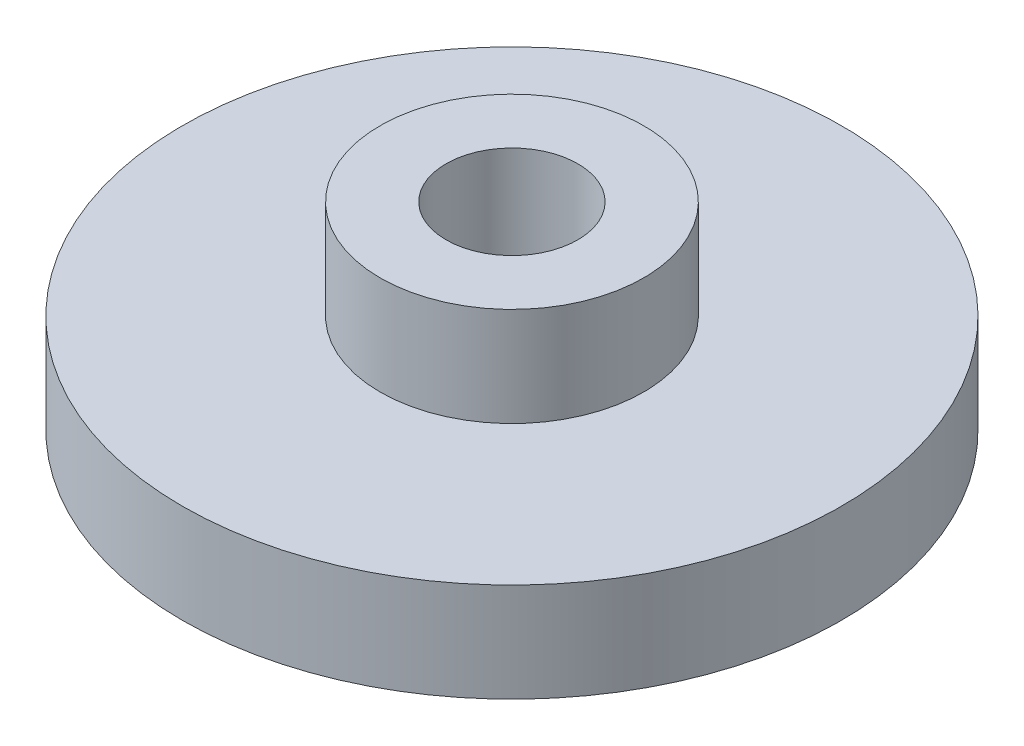
ISO-10303-21;
HEADER;
FILE_DESCRIPTION(('STEP AP214'),'2;1');
FILE_NAME('part.step','',(''),(''),'','','');
FILE_SCHEMA(('AUTOMOTIVE_DESIGN { 1 0 10303 214 1 1 1 1 }'));
ENDSEC;
DATA;
#1=APPLICATION_CONTEXT('core data for automotive mechanical design processes');
#2=APPLICATION_PROTOCOL_DEFINITION('international standard','automotive_design',2000,#1);
#3=PRODUCT_CONTEXT('',#1,'mechanical');
#4=PRODUCT('Part','Part','',(#3));
#5=PRODUCT_RELATED_PRODUCT_CATEGORY('part','',(#4));
#6=PRODUCT_DEFINITION_FORMATION('','',#4);
#7=PRODUCT_DEFINITION_CONTEXT('part definition',#1,'design');
#8=PRODUCT_DEFINITION('design','',#6,#7);
#9=PRODUCT_DEFINITION_SHAPE('','',#8);
#10=(LENGTH_UNIT() NAMED_UNIT(*) SI_UNIT(.MILLI.,.METRE.));
#11=(NAMED_UNIT(*) PLANE_ANGLE_UNIT() SI_UNIT($,.RADIAN.));
#12=(NAMED_UNIT(*) SI_UNIT($,.STERADIAN.) SOLID_ANGLE_UNIT());
#13=UNCERTAINTY_MEASURE_WITH_UNIT(LENGTH_MEASURE(1.E-05),#10,'distance_accuracy_value','');
#14=(GEOMETRIC_REPRESENTATION_CONTEXT(3) GLOBAL_UNCERTAINTY_ASSIGNED_CONTEXT((#13)) GLOBAL_UNIT_ASSIGNED_CONTEXT((#10,
#11,#12)) REPRESENTATION_CONTEXT('',''));
#15=CARTESIAN_POINT('',(0.,0.,0.));
#16=DIRECTION('',(0.,0.,1.));
#17=DIRECTION('',(1.,0.,0.));
#18=AXIS2_PLACEMENT_3D('',#15,#16,#17);
#19=CARTESIAN_POINT('',(0.,6.,0.));
#20=DIRECTION('',(0.,1.,0.));
#21=DIRECTION('',(0.,0.,1.));
#22=AXIS2_PLACEMENT_3D('',#19,#20,#21);
#23=PLANE('',#22);
#24=CARTESIAN_POINT('',(0.,6.,0.));
#25=DIRECTION('',(0.,1.,0.));
#26=DIRECTION('',(0.,0.,1.));
#27=AXIS2_PLACEMENT_3D('',#24,#25,#26);
#28=CIRCLE('',#27,20.);
#29=CARTESIAN_POINT('',(0.,6.,20.));
#30=VERTEX_POINT('',#29);
#31=EDGE_CURVE('E10',#30,#30,#28,.T.);
#32=ORIENTED_EDGE('',*,*,#31,.T.);
#33=EDGE_LOOP('',(#32));
#34=FACE_BOUND('',#33,.T.);
#35=CARTESIAN_POINT('',(0.,6.,0.));
#36=DIRECTION('',(0.,1.,0.));
#37=DIRECTION('',(0.,0.,1.));
#38=AXIS2_PLACEMENT_3D('',#35,#36,#37);
#39=CIRCLE('',#38,8.);
#40=CARTESIAN_POINT('',(0.,6.,8.));
#41=VERTEX_POINT('',#40);
#42=EDGE_CURVE('E43',#41,#41,#39,.T.);
#43=ORIENTED_EDGE('',*,*,#42,.F.);
#44=EDGE_LOOP('',(#43));
#45=FACE_BOUND('',#44,.T.);
#46=ADVANCED_FACE('F30',(#34,#45),#23,.T.);
#47=CARTESIAN_POINT('',(0.,6.,0.));
#48=DIRECTION('',(0.,-1.,0.));
#49=DIRECTION('',(0.,0.,-1.));
#50=AXIS2_PLACEMENT_3D('',#47,#48,#49);
#51=CYLINDRICAL_SURFACE('',#50,20.);
#52=ORIENTED_EDGE('',*,*,#31,.F.);
#53=EDGE_LOOP('',(#52));
#54=FACE_BOUND('',#53,.T.);
#55=CARTESIAN_POINT('',(0.,0.,0.));
#56=DIRECTION('',(0.,1.,0.));
#57=DIRECTION('',(0.,0.,1.));
#58=AXIS2_PLACEMENT_3D('',#55,#56,#57);
#59=CIRCLE('',#58,20.);
#60=CARTESIAN_POINT('',(0.,0.,20.));
#61=VERTEX_POINT('',#60);
#62=EDGE_CURVE('E34',#61,#61,#59,.T.);
#63=ORIENTED_EDGE('',*,*,#62,.T.);
#64=EDGE_LOOP('',(#63));
#65=FACE_BOUND('',#64,.T.);
#66=ADVANCED_FACE('F32',(#54,#65),#51,.T.);
#67=CARTESIAN_POINT('',(0.,0.,0.));
#68=DIRECTION('',(0.,1.,0.));
#69=DIRECTION('',(0.,0.,1.));
#70=AXIS2_PLACEMENT_3D('',#67,#68,#69);
#71=PLANE('',#70);
#72=CARTESIAN_POINT('',(0.,0.,0.));
#73=DIRECTION('',(0.,1.,0.));
#74=DIRECTION('',(0.,0.,1.));
#75=AXIS2_PLACEMENT_3D('',#72,#73,#74);
#76=CIRCLE('',#75,4.);
#77=CARTESIAN_POINT('',(0.,0.,4.));
#78=VERTEX_POINT('',#77);
#79=EDGE_CURVE('E46',#78,#78,#76,.T.);
#80=ORIENTED_EDGE('',*,*,#79,.T.);
#81=EDGE_LOOP('',(#80));
#82=FACE_BOUND('',#81,.T.);
#83=ORIENTED_EDGE('',*,*,#62,.F.);
#84=EDGE_LOOP('',(#83));
#85=FACE_BOUND('',#84,.T.);
#86=ADVANCED_FACE('F55',(#82,#85),#71,.F.);
#87=CARTESIAN_POINT('',(0.,12.,0.));
#88=DIRECTION('',(0.,-1.,0.));
#89=DIRECTION('',(0.,0.,-1.));
#90=AXIS2_PLACEMENT_3D('',#87,#88,#89);
#91=CYLINDRICAL_SURFACE('',#90,8.);
#92=CARTESIAN_POINT('',(0.,12.,0.));
#93=DIRECTION('',(0.,1.,0.));
#94=DIRECTION('',(0.,0.,1.));
#95=AXIS2_PLACEMENT_3D('',#92,#93,#94);
#96=CIRCLE('',#95,8.);
#97=CARTESIAN_POINT('',(0.,12.,8.));
#98=VERTEX_POINT('',#97);
#99=EDGE_CURVE('E41',#98,#98,#96,.T.);
#100=ORIENTED_EDGE('',*,*,#99,.F.);
#101=EDGE_LOOP('',(#100));
#102=FACE_BOUND('',#101,.T.);
#103=ORIENTED_EDGE('',*,*,#42,.T.);
#104=EDGE_LOOP('',(#103));
#105=FACE_BOUND('',#104,.T.);
#106=ADVANCED_FACE('F67',(#102,#105),#91,.T.);
#107=CARTESIAN_POINT('',(0.,12.,0.));
#108=DIRECTION('',(0.,1.,0.));
#109=DIRECTION('',(0.,0.,1.));
#110=AXIS2_PLACEMENT_3D('',#107,#108,#109);
#111=PLANE('',#110);
#112=CARTESIAN_POINT('',(0.,12.,0.));
#113=DIRECTION('',(0.,1.,0.));
#114=DIRECTION('',(0.,0.,1.));
#115=AXIS2_PLACEMENT_3D('',#112,#113,#114);
#116=CIRCLE('',#115,4.);
#117=CARTESIAN_POINT('',(0.,12.,4.));
#118=VERTEX_POINT('',#117);
#119=EDGE_CURVE('E49',#118,#118,#116,.T.);
#120=ORIENTED_EDGE('',*,*,#119,.F.);
#121=EDGE_LOOP('',(#120));
#122=FACE_BOUND('',#121,.T.);
#123=ORIENTED_EDGE('',*,*,#99,.T.);
#124=EDGE_LOOP('',(#123));
#125=FACE_BOUND('',#124,.T.);
#126=ADVANCED_FACE('F61',(#122,#125),#111,.T.);
#127=CARTESIAN_POINT('',(0.,0.,0.));
#128=DIRECTION('',(0.,1.,0.));
#129=DIRECTION('',(0.,0.,1.));
#130=AXIS2_PLACEMENT_3D('',#127,#128,#129);
#131=CYLINDRICAL_SURFACE('',#130,4.);
#132=ORIENTED_EDGE('',*,*,#79,.F.);
#133=EDGE_LOOP('',(#132));
#134=FACE_BOUND('',#133,.T.);
#135=ORIENTED_EDGE('',*,*,#119,.T.);
#136=EDGE_LOOP('',(#135));
#137=FACE_BOUND('',#136,.T.);
#138=ADVANCED_FACE('F58',(#134,#137),#131,.F.);
#139=CLOSED_SHELL('',(#46,#66,#86,#106,#126,#138));
#140=MANIFOLD_SOLID_BREP('B2',#139);
#141=ADVANCED_BREP_SHAPE_REPRESENTATION('',(#18,#140),#14);
#142=SHAPE_DEFINITION_REPRESENTATION(#9,#141);
ENDSEC;
END-ISO-10303-21;
